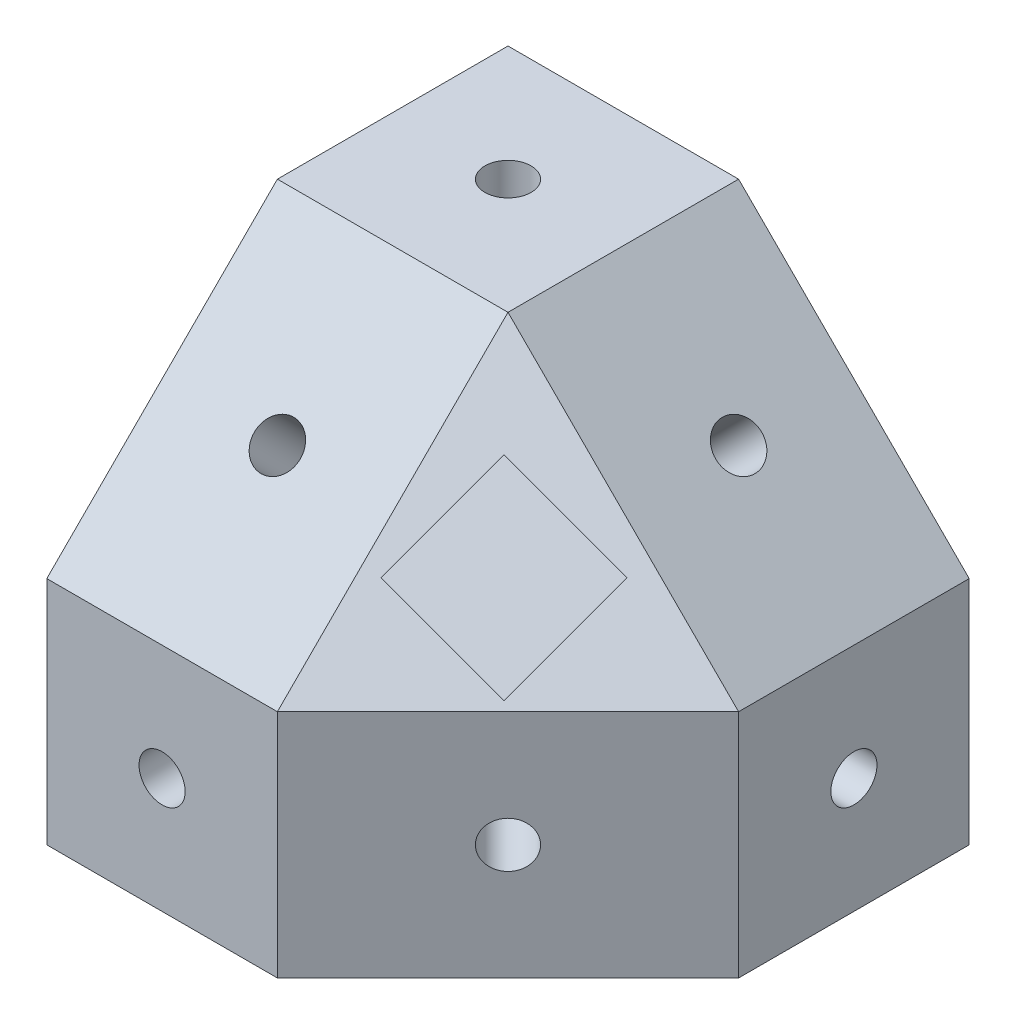
ISO-10303-21;
HEADER;
FILE_DESCRIPTION(('STEP AP214'),'2;1');
FILE_NAME('part.step','',(''),(''),'','','');
FILE_SCHEMA(('AUTOMOTIVE_DESIGN { 1 0 10303 214 1 1 1 1 }'));
ENDSEC;
DATA;
#1=APPLICATION_CONTEXT('core data for automotive mechanical design processes');
#2=APPLICATION_PROTOCOL_DEFINITION('international standard','automotive_design',2000,#1);
#3=PRODUCT_CONTEXT('',#1,'mechanical');
#4=PRODUCT('Part','Part','',(#3));
#5=PRODUCT_RELATED_PRODUCT_CATEGORY('part','',(#4));
#6=PRODUCT_DEFINITION_FORMATION('','',#4);
#7=PRODUCT_DEFINITION_CONTEXT('part definition',#1,'design');
#8=PRODUCT_DEFINITION('design','',#6,#7);
#9=PRODUCT_DEFINITION_SHAPE('','',#8);
#10=(LENGTH_UNIT() NAMED_UNIT(*) SI_UNIT(.MILLI.,.METRE.));
#11=(NAMED_UNIT(*) PLANE_ANGLE_UNIT() SI_UNIT($,.RADIAN.));
#12=(NAMED_UNIT(*) SI_UNIT($,.STERADIAN.) SOLID_ANGLE_UNIT());
#13=UNCERTAINTY_MEASURE_WITH_UNIT(LENGTH_MEASURE(1.E-05),#10,'distance_accuracy_value','');
#14=(GEOMETRIC_REPRESENTATION_CONTEXT(3) GLOBAL_UNCERTAINTY_ASSIGNED_CONTEXT((#13)) GLOBAL_UNIT_ASSIGNED_CONTEXT((#10,
#11,#12)) REPRESENTATION_CONTEXT('',''));
#15=CARTESIAN_POINT('',(0.,0.,0.));
#16=DIRECTION('',(0.,0.,1.));
#17=DIRECTION('',(1.,0.,0.));
#18=AXIS2_PLACEMENT_3D('',#15,#16,#17);
#19=CARTESIAN_POINT('',(15.,30.,-30.));
#20=DIRECTION('',(-0.707106781186547,-0.707106781186548,0.));
#21=DIRECTION('',(0.707106781186548,-0.707106781186547,0.));
#22=AXIS2_PLACEMENT_3D('',#19,#20,#21);
#23=PLANE('',#22);
#24=CARTESIAN_POINT('',(22.5011325855167,22.4988674144833,-22.5));
#25=DIRECTION('',(0.707106781186547,0.707106781186548,0.));
#26=DIRECTION('',(-0.707106781186548,0.707106781186547,0.));
#27=AXIS2_PLACEMENT_3D('',#24,#25,#26);
#28=CIRCLE('',#27,1.5);
#29=CARTESIAN_POINT('',(21.4404724137368,23.5595275862632,-22.5));
#30=VERTEX_POINT('',#29);
#31=EDGE_CURVE('E189',#30,#30,#28,.T.);
#32=ORIENTED_EDGE('',*,*,#31,.F.);
#33=EDGE_LOOP('',(#32));
#34=FACE_BOUND('',#33,.T.);
#35=DIRECTION('',(-0.707106781186548,0.707106781186547,0.));
#36=VECTOR('',#35,1.);
#37=CARTESIAN_POINT('',(15.,30.,-15.));
#38=LINE('',#37,#36);
#39=CARTESIAN_POINT('',(30.,15.,-15.));
#40=VERTEX_POINT('',#39);
#41=CARTESIAN_POINT('',(15.,30.,-15.));
#42=VERTEX_POINT('',#41);
#43=EDGE_CURVE('E267',#40,#42,#38,.T.);
#44=ORIENTED_EDGE('',*,*,#43,.F.);
#45=DIRECTION('',(0.,0.,1.));
#46=VECTOR('',#45,1.);
#47=CARTESIAN_POINT('',(30.,15.,-30.));
#48=LINE('',#47,#46);
#49=CARTESIAN_POINT('',(30.,15.,-30.));
#50=VERTEX_POINT('',#49);
#51=EDGE_CURVE('E295',#50,#40,#48,.T.);
#52=ORIENTED_EDGE('',*,*,#51,.F.);
#53=DIRECTION('',(0.707106781186548,-0.707106781186547,0.));
#54=VECTOR('',#53,1.);
#55=CARTESIAN_POINT('',(15.,30.,-30.));
#56=LINE('',#55,#54);
#57=CARTESIAN_POINT('',(15.,30.,-30.));
#58=VERTEX_POINT('',#57);
#59=EDGE_CURVE('E288',#58,#50,#56,.T.);
#60=ORIENTED_EDGE('',*,*,#59,.F.);
#61=DIRECTION('',(0.,0.,1.));
#62=VECTOR('',#61,1.);
#63=CARTESIAN_POINT('',(15.,30.,-30.));
#64=LINE('',#63,#62);
#65=EDGE_CURVE('E294',#58,#42,#64,.T.);
#66=ORIENTED_EDGE('',*,*,#65,.T.);
#67=EDGE_LOOP('',(#44,#52,#60,#66));
#68=FACE_BOUND('',#67,.T.);
#69=ADVANCED_FACE('F71',(#34,#68),#23,.F.);
#70=CARTESIAN_POINT('',(30.,15.,0.));
#71=DIRECTION('',(0.,-0.707106781186547,-0.707106781186547));
#72=DIRECTION('',(0.,0.707106781186548,-0.707106781186548));
#73=AXIS2_PLACEMENT_3D('',#70,#71,#72);
#74=PLANE('',#73);
#75=CARTESIAN_POINT('',(7.5,22.5,-7.5));
#76=DIRECTION('',(0.,0.707106781186548,0.707106781186547));
#77=DIRECTION('',(0.,-0.707106781186547,0.707106781186548));
#78=AXIS2_PLACEMENT_3D('',#75,#76,#77);
#79=CIRCLE('',#78,1.5);
#80=CARTESIAN_POINT('',(7.5,21.4393398282202,-6.43933982822018));
#81=VERTEX_POINT('',#80);
#82=EDGE_CURVE('E203',#81,#81,#79,.T.);
#83=ORIENTED_EDGE('',*,*,#82,.F.);
#84=EDGE_LOOP('',(#83));
#85=FACE_BOUND('',#84,.T.);
#86=DIRECTION('',(0.,-0.707106781186548,0.707106781186548));
#87=VECTOR('',#86,1.);
#88=CARTESIAN_POINT('',(15.,15.,0.));
#89=LINE('',#88,#87);
#90=CARTESIAN_POINT('',(15.,15.,0.));
#91=VERTEX_POINT('',#90);
#92=EDGE_CURVE('E255',#42,#91,#89,.T.);
#93=ORIENTED_EDGE('',*,*,#92,.F.);
#94=DIRECTION('',(-1.,0.,0.));
#95=VECTOR('',#94,1.);
#96=CARTESIAN_POINT('',(30.,30.,-15.));
#97=LINE('',#96,#95);
#98=CARTESIAN_POINT('',(0.,30.,-15.));
#99=VERTEX_POINT('',#98);
#100=EDGE_CURVE('E284',#42,#99,#97,.T.);
#101=ORIENTED_EDGE('',*,*,#100,.T.);
#102=DIRECTION('',(0.,-0.707106781186547,0.707106781186547));
#103=VECTOR('',#102,1.);
#104=CARTESIAN_POINT('',(0.,15.,0.));
#105=LINE('',#104,#103);
#106=CARTESIAN_POINT('',(0.,15.,0.));
#107=VERTEX_POINT('',#106);
#108=EDGE_CURVE('E278',#99,#107,#105,.T.);
#109=ORIENTED_EDGE('',*,*,#108,.T.);
#110=DIRECTION('',(-1.,0.,0.));
#111=VECTOR('',#110,1.);
#112=CARTESIAN_POINT('',(30.,15.,0.));
#113=LINE('',#112,#111);
#114=EDGE_CURVE('E285',#91,#107,#113,.T.);
#115=ORIENTED_EDGE('',*,*,#114,.F.);
#116=EDGE_LOOP('',(#93,#101,#109,#115));
#117=FACE_BOUND('',#116,.T.);
#118=ADVANCED_FACE('F371',(#85,#117),#74,.F.);
#119=CARTESIAN_POINT('',(15.,30.,0.));
#120=DIRECTION('',(-0.707106781186547,0.,-0.707106781186547));
#121=DIRECTION('',(-0.707106781186548,0.,0.707106781186548));
#122=AXIS2_PLACEMENT_3D('',#119,#120,#121);
#123=PLANE('',#122);
#124=CARTESIAN_POINT('',(22.4988674144833,7.5,-7.49886741448334));
#125=DIRECTION('',(0.707106781186548,0.,0.707106781186547));
#126=DIRECTION('',(0.707106781186547,0.,-0.707106781186548));
#127=AXIS2_PLACEMENT_3D('',#124,#125,#126);
#128=CIRCLE('',#127,1.5);
#129=CARTESIAN_POINT('',(23.5595275862632,7.5,-8.55952758626316));
#130=VERTEX_POINT('',#129);
#131=EDGE_CURVE('E175',#130,#130,#128,.T.);
#132=ORIENTED_EDGE('',*,*,#131,.F.);
#133=EDGE_LOOP('',(#132));
#134=FACE_BOUND('',#133,.T.);
#135=DIRECTION('',(0.707106781186548,0.,-0.707106781186548));
#136=VECTOR('',#135,1.);
#137=CARTESIAN_POINT('',(15.,15.,0.));
#138=LINE('',#137,#136);
#139=EDGE_CURVE('E329',#91,#40,#138,.T.);
#140=ORIENTED_EDGE('',*,*,#139,.F.);
#141=DIRECTION('',(0.,-1.,0.));
#142=VECTOR('',#141,1.);
#143=CARTESIAN_POINT('',(15.,30.,0.));
#144=LINE('',#143,#142);
#145=CARTESIAN_POINT('',(15.,0.,0.));
#146=VERTEX_POINT('',#145);
#147=EDGE_CURVE('E273',#91,#146,#144,.T.);
#148=ORIENTED_EDGE('',*,*,#147,.T.);
#149=DIRECTION('',(0.707106781186547,0.,-0.707106781186547));
#150=VECTOR('',#149,1.);
#151=CARTESIAN_POINT('',(15.,0.,0.));
#152=LINE('',#151,#150);
#153=CARTESIAN_POINT('',(30.,0.,-15.));
#154=VERTEX_POINT('',#153);
#155=EDGE_CURVE('E270',#146,#154,#152,.T.);
#156=ORIENTED_EDGE('',*,*,#155,.T.);
#157=DIRECTION('',(0.,-1.,0.));
#158=VECTOR('',#157,1.);
#159=CARTESIAN_POINT('',(30.,30.,-15.));
#160=LINE('',#159,#158);
#161=EDGE_CURVE('E274',#40,#154,#160,.T.);
#162=ORIENTED_EDGE('',*,*,#161,.F.);
#163=EDGE_LOOP('',(#140,#148,#156,#162));
#164=FACE_BOUND('',#163,.T.);
#165=ADVANCED_FACE('F350',(#134,#164),#123,.F.);
#166=CARTESIAN_POINT('',(0.,0.,-30.));
#167=DIRECTION('',(-1.,0.,0.));
#168=DIRECTION('',(0.,-1.,0.));
#169=AXIS2_PLACEMENT_3D('',#166,#167,#168);
#170=PLANE('',#169);
#171=ORIENTED_EDGE('',*,*,#108,.F.);
#172=DIRECTION('',(0.,0.,1.));
#173=VECTOR('',#172,1.);
#174=CARTESIAN_POINT('',(0.,30.,-30.));
#175=LINE('',#174,#173);
#176=CARTESIAN_POINT('',(0.,30.,-30.));
#177=VERTEX_POINT('',#176);
#178=EDGE_CURVE('E325',#177,#99,#175,.T.);
#179=ORIENTED_EDGE('',*,*,#178,.F.);
#180=DIRECTION('',(0.,-1.,0.));
#181=VECTOR('',#180,1.);
#182=CARTESIAN_POINT('',(0.,0.,-30.));
#183=LINE('',#182,#181);
#184=CARTESIAN_POINT('',(0.,0.,-30.));
#185=VERTEX_POINT('',#184);
#186=EDGE_CURVE('E303',#177,#185,#183,.T.);
#187=ORIENTED_EDGE('',*,*,#186,.T.);
#188=DIRECTION('',(0.,0.,1.));
#189=VECTOR('',#188,1.);
#190=CARTESIAN_POINT('',(0.,0.,-30.));
#191=LINE('',#190,#189);
#192=CARTESIAN_POINT('',(0.,0.,0.));
#193=VERTEX_POINT('',#192);
#194=EDGE_CURVE('E319',#185,#193,#191,.T.);
#195=ORIENTED_EDGE('',*,*,#194,.T.);
#196=DIRECTION('',(0.,-1.,0.));
#197=VECTOR('',#196,1.);
#198=CARTESIAN_POINT('',(0.,0.,0.));
#199=LINE('',#198,#197);
#200=EDGE_CURVE('E299',#107,#193,#199,.T.);
#201=ORIENTED_EDGE('',*,*,#200,.F.);
#202=EDGE_LOOP('',(#171,#179,#187,#195,#201));
#203=FACE_BOUND('',#202,.T.);
#204=ADVANCED_FACE('F73',(#203),#170,.T.);
#205=CARTESIAN_POINT('',(0.,30.,-30.));
#206=DIRECTION('',(0.,1.,0.));
#207=DIRECTION('',(0.,0.,1.));
#208=AXIS2_PLACEMENT_3D('',#205,#206,#207);
#209=PLANE('',#208);
#210=CARTESIAN_POINT('',(7.49999999999999,30.,-22.5));
#211=DIRECTION('',(0.,1.,0.));
#212=DIRECTION('',(0.,0.,1.));
#213=AXIS2_PLACEMENT_3D('',#210,#211,#212);
#214=CIRCLE('',#213,1.5);
#215=CARTESIAN_POINT('',(7.49999999999999,30.,-21.));
#216=VERTEX_POINT('',#215);
#217=EDGE_CURVE('E211',#216,#216,#214,.T.);
#218=ORIENTED_EDGE('',*,*,#217,.F.);
#219=EDGE_LOOP('',(#218));
#220=FACE_BOUND('',#219,.T.);
#221=ORIENTED_EDGE('',*,*,#100,.F.);
#222=ORIENTED_EDGE('',*,*,#65,.F.);
#223=DIRECTION('',(-1.,0.,0.));
#224=VECTOR('',#223,1.);
#225=CARTESIAN_POINT('',(0.,30.,-30.));
#226=LINE('',#225,#224);
#227=EDGE_CURVE('E316',#58,#177,#226,.T.);
#228=ORIENTED_EDGE('',*,*,#227,.T.);
#229=ORIENTED_EDGE('',*,*,#178,.T.);
#230=EDGE_LOOP('',(#221,#222,#228,#229));
#231=FACE_BOUND('',#230,.T.);
#232=ADVANCED_FACE('F369',(#220,#231),#209,.T.);
#233=CARTESIAN_POINT('',(30.,0.,-30.));
#234=DIRECTION('',(1.,0.,0.));
#235=DIRECTION('',(0.,1.,0.));
#236=AXIS2_PLACEMENT_3D('',#233,#234,#235);
#237=PLANE('',#236);
#238=CARTESIAN_POINT('',(30.,7.5,-22.5));
#239=DIRECTION('',(1.,0.,0.));
#240=DIRECTION('',(0.,1.,0.));
#241=AXIS2_PLACEMENT_3D('',#238,#239,#240);
#242=CIRCLE('',#241,1.5);
#243=CARTESIAN_POINT('',(30.,9.,-22.5));
#244=VERTEX_POINT('',#243);
#245=EDGE_CURVE('E179',#244,#244,#242,.T.);
#246=ORIENTED_EDGE('',*,*,#245,.F.);
#247=EDGE_LOOP('',(#246));
#248=FACE_BOUND('',#247,.T.);
#249=ORIENTED_EDGE('',*,*,#161,.T.);
#250=DIRECTION('',(0.,0.,1.));
#251=VECTOR('',#250,1.);
#252=CARTESIAN_POINT('',(30.,0.,-30.));
#253=LINE('',#252,#251);
#254=CARTESIAN_POINT('',(30.,0.,-30.));
#255=VERTEX_POINT('',#254);
#256=EDGE_CURVE('E330',#255,#154,#253,.T.);
#257=ORIENTED_EDGE('',*,*,#256,.F.);
#258=DIRECTION('',(0.,1.,0.));
#259=VECTOR('',#258,1.);
#260=CARTESIAN_POINT('',(30.,0.,-30.));
#261=LINE('',#260,#259);
#262=EDGE_CURVE('E312',#255,#50,#261,.T.);
#263=ORIENTED_EDGE('',*,*,#262,.T.);
#264=ORIENTED_EDGE('',*,*,#51,.T.);
#265=EDGE_LOOP('',(#249,#257,#263,#264));
#266=FACE_BOUND('',#265,.T.);
#267=ADVANCED_FACE('F353',(#248,#266),#237,.T.);
#268=CARTESIAN_POINT('',(0.,0.,-30.));
#269=DIRECTION('',(0.,-1.,0.));
#270=DIRECTION('',(0.,0.,-1.));
#271=AXIS2_PLACEMENT_3D('',#268,#269,#270);
#272=PLANE('',#271);
#273=ORIENTED_EDGE('',*,*,#155,.F.);
#274=DIRECTION('',(1.,0.,0.));
#275=VECTOR('',#274,1.);
#276=CARTESIAN_POINT('',(0.,0.,0.));
#277=LINE('',#276,#275);
#278=EDGE_CURVE('E308',#193,#146,#277,.T.);
#279=ORIENTED_EDGE('',*,*,#278,.F.);
#280=ORIENTED_EDGE('',*,*,#194,.F.);
#281=DIRECTION('',(1.,0.,0.));
#282=VECTOR('',#281,1.);
#283=CARTESIAN_POINT('',(0.,0.,-30.));
#284=LINE('',#283,#282);
#285=EDGE_CURVE('E307',#185,#255,#284,.T.);
#286=ORIENTED_EDGE('',*,*,#285,.T.);
#287=ORIENTED_EDGE('',*,*,#256,.T.);
#288=EDGE_LOOP('',(#273,#279,#280,#286,#287));
#289=FACE_BOUND('',#288,.T.);
#290=ADVANCED_FACE('F361',(#289),#272,.T.);
#291=CARTESIAN_POINT('',(0.,0.,-30.));
#292=DIRECTION('',(0.,0.,-1.));
#293=DIRECTION('',(-1.,0.,0.));
#294=AXIS2_PLACEMENT_3D('',#291,#292,#293);
#295=PLANE('',#294);
#296=ORIENTED_EDGE('',*,*,#59,.T.);
#297=ORIENTED_EDGE('',*,*,#262,.F.);
#298=ORIENTED_EDGE('',*,*,#285,.F.);
#299=ORIENTED_EDGE('',*,*,#186,.F.);
#300=ORIENTED_EDGE('',*,*,#227,.F.);
#301=EDGE_LOOP('',(#296,#297,#298,#299,#300));
#302=FACE_BOUND('',#301,.T.);
#303=ADVANCED_FACE('F357',(#302),#295,.T.);
#304=CARTESIAN_POINT('',(0.,0.,0.));
#305=DIRECTION('',(0.,0.,-1.));
#306=DIRECTION('',(-1.,0.,0.));
#307=AXIS2_PLACEMENT_3D('',#304,#305,#306);
#308=PLANE('',#307);
#309=CARTESIAN_POINT('',(7.49999999999999,7.5,0.));
#310=DIRECTION('',(0.,0.,1.));
#311=DIRECTION('',(1.,0.,0.));
#312=AXIS2_PLACEMENT_3D('',#309,#310,#311);
#313=CIRCLE('',#312,1.5);
#314=CARTESIAN_POINT('',(8.99999999999999,7.5,0.));
#315=VERTEX_POINT('',#314);
#316=EDGE_CURVE('E195',#315,#315,#313,.T.);
#317=ORIENTED_EDGE('',*,*,#316,.F.);
#318=EDGE_LOOP('',(#317));
#319=FACE_BOUND('',#318,.T.);
#320=ORIENTED_EDGE('',*,*,#278,.T.);
#321=ORIENTED_EDGE('',*,*,#147,.F.);
#322=ORIENTED_EDGE('',*,*,#114,.T.);
#323=ORIENTED_EDGE('',*,*,#200,.T.);
#324=EDGE_LOOP('',(#320,#321,#322,#323));
#325=FACE_BOUND('',#324,.T.);
#326=ADVANCED_FACE('F374',(#319,#325),#308,.F.);
#327=CARTESIAN_POINT('',(33.9969093541148,3.5700475177221,-7.56695687183688));
#328=DIRECTION('',(0.577350269189626,0.577350269189626,0.577350269189625));
#329=DIRECTION('',(-0.707106781186547,0.707106781186548,0.));
#330=AXIS2_PLACEMENT_3D('',#327,#328,#329);
#331=PLANE('',#330);
#332=DIRECTION('',(0.788675134594812,-0.577350269189629,-0.211324865405183));
#333=VECTOR('',#332,1.);
#334=CARTESIAN_POINT('',(22.1689725569192,15.4082482904639,-7.57722084738306));
#335=LINE('',#334,#333);
#336=CARTESIAN_POINT('',(15.8595714801607,20.0270504439809,-5.88662192414159));
#337=VERTEX_POINT('',#336);
#338=CARTESIAN_POINT('',(22.1689725569192,15.4082482904639,-7.57722084738306));
#339=VERTEX_POINT('',#338);
#340=EDGE_CURVE('E219',#337,#339,#335,.T.);
#341=ORIENTED_EDGE('',*,*,#340,.F.);
#342=DIRECTION('',(-0.211324865405191,-0.577350269189623,0.788675134594814));
#343=VECTOR('',#342,1.);
#344=CARTESIAN_POINT('',(15.8595714801607,20.0270504439809,-5.88662192414159));
#345=LINE('',#344,#343);
#346=CARTESIAN_POINT('',(17.5501704034022,24.6458525974979,-12.1960230009001));
#347=VERTEX_POINT('',#346);
#348=EDGE_CURVE('E228',#347,#337,#345,.T.);
#349=ORIENTED_EDGE('',*,*,#348,.F.);
#350=DIRECTION('',(-0.788675134594811,0.577350269189629,0.211324865405183));
#351=VECTOR('',#350,1.);
#352=CARTESIAN_POINT('',(17.5501704034022,24.6458525974979,-12.1960230009001));
#353=LINE('',#352,#351);
#354=CARTESIAN_POINT('',(23.8595714801607,20.0270504439808,-13.8866219241416));
#355=VERTEX_POINT('',#354);
#356=EDGE_CURVE('E245',#355,#347,#353,.T.);
#357=ORIENTED_EDGE('',*,*,#356,.F.);
#358=DIRECTION('',(0.211324865405191,0.577350269189623,-0.788675134594814));
#359=VECTOR('',#358,1.);
#360=CARTESIAN_POINT('',(23.8595714801607,20.0270504439808,-13.8866219241416));
#361=LINE('',#360,#359);
#362=EDGE_CURVE('E242',#339,#355,#361,.T.);
#363=ORIENTED_EDGE('',*,*,#362,.F.);
#364=EDGE_LOOP('',(#341,#349,#357,#363));
#365=FACE_BOUND('',#364,.T.);
#366=ORIENTED_EDGE('',*,*,#43,.T.);
#367=ORIENTED_EDGE('',*,*,#92,.T.);
#368=ORIENTED_EDGE('',*,*,#139,.T.);
#369=EDGE_LOOP('',(#366,#367,#368));
#370=FACE_BOUND('',#369,.T.);
#371=ADVANCED_FACE('F343',(#365,#370),#331,.T.);
#372=CARTESIAN_POINT('',(13.5087185190748,6.74799425261948,-16.2374748852274));
#373=DIRECTION('',(-0.211324865405191,-0.577350269189623,0.788675134594814));
#374=DIRECTION('',(0.,-0.806898221355075,-0.59069049456887));
#375=AXIS2_PLACEMENT_3D('',#372,#373,#374);
#376=PLANE('',#375);
#377=DIRECTION('',(0.577350269189626,0.577350269189626,0.577350269189625));
#378=VECTOR('',#377,1.);
#379=CARTESIAN_POINT('',(13.5087185190748,6.74799425261948,-16.2374748852274));
#380=LINE('',#379,#378);
#381=CARTESIAN_POINT('',(15.7501414195185,8.9894171530632,-13.9960519847837));
#382=VERTEX_POINT('',#381);
#383=EDGE_CURVE('E94',#382,#339,#380,.T.);
#384=ORIENTED_EDGE('',*,*,#383,.F.);
#385=CARTESIAN_POINT('',(14.6043362426511,7.5,-15.3933985863156));
#386=DIRECTION('',(-0.211324865405191,-0.577350269189623,0.788675134594814));
#387=DIRECTION('',(0.869104022117883,0.258198889747158,0.421890426617925));
#388=AXIS2_PLACEMENT_3D('',#385,#386,#387);
#389=ELLIPSE('',#388,3.67423461417479,1.5);
#390=CARTESIAN_POINT('',(15.0839669343387,8.91899901072835,-14.2261025580696));
#391=VERTEX_POINT('',#390);
#392=EDGE_CURVE('E170',#382,#391,#389,.T.);
#393=ORIENTED_EDGE('',*,*,#392,.T.);
#394=DIRECTION('',(-0.447213595499955,0.774596669241487,0.447213595499955));
#395=VECTOR('',#394,1.);
#396=CARTESIAN_POINT('',(15.9232498256211,7.46531840110381,-15.0653854493521));
#397=LINE('',#396,#395);
#398=CARTESIAN_POINT('',(15.3020288902856,8.54130462383032,-14.4441645140166));
#399=VERTEX_POINT('',#398);
#400=EDGE_CURVE('E163',#399,#391,#397,.T.);
#401=ORIENTED_EDGE('',*,*,#400,.F.);
#402=CARTESIAN_POINT('',(13.5087185190748,6.74799425261948,-16.2374748852274));
#403=VERTEX_POINT('',#402);
#404=EDGE_CURVE('E262',#403,#399,#380,.T.);
#405=ORIENTED_EDGE('',*,*,#404,.F.);
#406=DIRECTION('',(0.788675134594812,-0.577350269189629,-0.211324865405183));
#407=VECTOR('',#406,1.);
#408=CARTESIAN_POINT('',(13.5087185190748,6.74799425261948,-16.2374748852274));
#409=LINE('',#408,#407);
#410=CARTESIAN_POINT('',(7.19931744231632,11.3667964061365,-14.546875961986));
#411=VERTEX_POINT('',#410);
#412=EDGE_CURVE('E223',#411,#403,#409,.T.);
#413=ORIENTED_EDGE('',*,*,#412,.F.);
#414=DIRECTION('',(0.577350269189626,0.577350269189626,0.577350269189625));
#415=VECTOR('',#414,1.);
#416=CARTESIAN_POINT('',(7.19931744231632,11.3667964061365,-14.546875961986));
#417=LINE('',#416,#415);
#418=EDGE_CURVE('E252',#411,#337,#417,.T.);
#419=ORIENTED_EDGE('',*,*,#418,.T.);
#420=ORIENTED_EDGE('',*,*,#340,.T.);
#421=EDGE_LOOP('',(#384,#393,#401,#405,#413,#419,#420));
#422=FACE_BOUND('',#421,.T.);
#423=ADVANCED_FACE('F177',(#422),#376,.F.);
#424=CARTESIAN_POINT('',(7.19931744231632,11.3667964061365,-14.546875961986));
#425=DIRECTION('',(-0.788675134594812,0.577350269189629,0.211324865405183));
#426=DIRECTION('',(-0.590690494568875,-0.806898221355071,0.));
#427=AXIS2_PLACEMENT_3D('',#424,#425,#426);
#428=PLANE('',#427);
#429=ORIENTED_EDGE('',*,*,#348,.T.);
#430=ORIENTED_EDGE('',*,*,#418,.F.);
#431=DIRECTION('',(-0.211324865405191,-0.577350269189623,0.788675134594814));
#432=VECTOR('',#431,1.);
#433=CARTESIAN_POINT('',(7.19931744231632,11.3667964061365,-14.546875961986));
#434=LINE('',#433,#432);
#435=CARTESIAN_POINT('',(8.88991636555784,15.9855985596535,-20.8562770387445));
#436=VERTEX_POINT('',#435);
#437=EDGE_CURVE('E236',#436,#411,#434,.T.);
#438=ORIENTED_EDGE('',*,*,#437,.F.);
#439=DIRECTION('',(0.577350269189626,0.577350269189626,0.577350269189625));
#440=VECTOR('',#439,1.);
#441=CARTESIAN_POINT('',(8.88991636555784,15.9855985596535,-20.8562770387445));
#442=LINE('',#441,#440);
#443=EDGE_CURVE('E256',#436,#347,#442,.T.);
#444=ORIENTED_EDGE('',*,*,#443,.T.);
#445=EDGE_LOOP('',(#429,#430,#438,#444));
#446=FACE_BOUND('',#445,.T.);
#447=ADVANCED_FACE('F406',(#446),#428,.F.);
#448=CARTESIAN_POINT('',(8.88991636555784,15.9855985596535,-20.8562770387445));
#449=DIRECTION('',(0.211324865405191,0.577350269189622,-0.788675134594814));
#450=DIRECTION('',(0.,0.806898221355076,0.590690494568869));
#451=AXIS2_PLACEMENT_3D('',#448,#449,#450);
#452=PLANE('',#451);
#453=ORIENTED_EDGE('',*,*,#356,.T.);
#454=ORIENTED_EDGE('',*,*,#443,.F.);
#455=DIRECTION('',(-0.788675134594811,0.577350269189629,0.211324865405183));
#456=VECTOR('',#455,1.);
#457=CARTESIAN_POINT('',(8.88991636555784,15.9855985596535,-20.8562770387445));
#458=LINE('',#457,#456);
#459=CARTESIAN_POINT('',(15.1993174423163,11.3667964061365,-22.546875961986));
#460=VERTEX_POINT('',#459);
#461=EDGE_CURVE('E232',#460,#436,#458,.T.);
#462=ORIENTED_EDGE('',*,*,#461,.F.);
#463=DIRECTION('',(0.577350269189626,0.577350269189626,0.577350269189625));
#464=VECTOR('',#463,1.);
#465=CARTESIAN_POINT('',(15.1993174423163,11.3667964061365,-22.546875961986));
#466=LINE('',#465,#464);
#467=EDGE_CURVE('E259',#460,#355,#466,.T.);
#468=ORIENTED_EDGE('',*,*,#467,.T.);
#469=EDGE_LOOP('',(#453,#454,#462,#468));
#470=FACE_BOUND('',#469,.T.);
#471=ADVANCED_FACE('F411',(#470),#452,.F.);
#472=CARTESIAN_POINT('',(15.1993174423163,11.3667964061365,-22.546875961986));
#473=DIRECTION('',(0.788675134594812,-0.577350269189629,-0.211324865405183));
#474=DIRECTION('',(0.590690494568875,0.806898221355071,0.));
#475=AXIS2_PLACEMENT_3D('',#472,#473,#474);
#476=PLANE('',#475);
#477=DIRECTION('',(-0.447213595499961,-0.77459666924148,0.447213595499961));
#478=VECTOR('',#477,1.);
#479=CARTESIAN_POINT('',(17.8808079549502,13.0078809853242,-17.0229435786811));
#480=LINE('',#479,#478);
#481=CARTESIAN_POINT('',(15.5600939406026,8.98828640263706,-14.7022295643335));
#482=VERTEX_POINT('',#481);
#483=EDGE_CURVE('E80',#482,#399,#480,.T.);
#484=ORIENTED_EDGE('',*,*,#483,.F.);
#485=CARTESIAN_POINT('',(14.168653714924,7.5,-15.8290811140426));
#486=DIRECTION('',(0.788675134594812,-0.577350269189629,-0.211324865405183));
#487=DIRECTION('',(0.421890426617923,0.258198889747164,0.869104022117881));
#488=AXIS2_PLACEMENT_3D('',#485,#486,#487);
#489=ELLIPSE('',#488,3.67423461417475,1.5);
#490=EDGE_CURVE('E12',#482,#382,#489,.T.);
#491=ORIENTED_EDGE('',*,*,#490,.T.);
#492=ORIENTED_EDGE('',*,*,#383,.T.);
#493=ORIENTED_EDGE('',*,*,#362,.T.);
#494=ORIENTED_EDGE('',*,*,#467,.F.);
#495=DIRECTION('',(0.211324865405191,0.577350269189623,-0.788675134594814));
#496=VECTOR('',#495,1.);
#497=CARTESIAN_POINT('',(15.1993174423163,11.3667964061365,-22.546875961986));
#498=LINE('',#497,#496);
#499=EDGE_CURVE('E227',#403,#460,#498,.T.);
#500=ORIENTED_EDGE('',*,*,#499,.F.);
#501=ORIENTED_EDGE('',*,*,#404,.T.);
#502=EDGE_LOOP('',(#484,#491,#492,#493,#494,#500,#501));
#503=FACE_BOUND('',#502,.T.);
#504=ADVANCED_FACE('F407',(#503),#476,.F.);
#505=CARTESIAN_POINT('',(1.33974596215563,1.33974596215563,1.33974596215563));
#506=DIRECTION('',(-0.577350269189626,-0.577350269189626,-0.577350269189625));
#507=DIRECTION('',(0.707106781186547,-0.707106781186548,0.));
#508=AXIS2_PLACEMENT_3D('',#505,#506,#507);
#509=PLANE('',#508);
#510=ORIENTED_EDGE('',*,*,#412,.T.);
#511=ORIENTED_EDGE('',*,*,#499,.T.);
#512=ORIENTED_EDGE('',*,*,#461,.T.);
#513=ORIENTED_EDGE('',*,*,#437,.T.);
#514=EDGE_LOOP('',(#510,#511,#512,#513));
#515=FACE_BOUND('',#514,.T.);
#516=ADVANCED_FACE('F410',(#515),#509,.F.);
#517=CARTESIAN_POINT('',(7.49999999999999,20.,-22.5));
#518=DIRECTION('',(0.,1.,0.));
#519=DIRECTION('',(0.,0.,1.));
#520=AXIS2_PLACEMENT_3D('',#517,#518,#519);
#521=CYLINDRICAL_SURFACE('',#520,1.5);
#522=CARTESIAN_POINT('',(7.49999999999999,20.,-22.5));
#523=DIRECTION('',(0.,1.,0.));
#524=DIRECTION('',(0.,0.,1.));
#525=AXIS2_PLACEMENT_3D('',#522,#523,#524);
#526=CIRCLE('',#525,1.5);
#527=CARTESIAN_POINT('',(7.49999999999999,20.,-21.));
#528=VERTEX_POINT('',#527);
#529=EDGE_CURVE('E215',#528,#528,#526,.T.);
#530=ORIENTED_EDGE('',*,*,#529,.F.);
#531=EDGE_LOOP('',(#530));
#532=FACE_BOUND('',#531,.T.);
#533=ORIENTED_EDGE('',*,*,#217,.T.);
#534=EDGE_LOOP('',(#533));
#535=FACE_BOUND('',#534,.T.);
#536=ADVANCED_FACE('F420',(#532,#535),#521,.F.);
#537=CARTESIAN_POINT('',(7.49999999999999,20.,-22.5));
#538=DIRECTION('',(0.,1.,0.));
#539=DIRECTION('',(0.,0.,1.));
#540=AXIS2_PLACEMENT_3D('',#537,#538,#539);
#541=PLANE('',#540);
#542=ORIENTED_EDGE('',*,*,#529,.T.);
#543=EDGE_LOOP('',(#542));
#544=FACE_BOUND('',#543,.T.);
#545=ADVANCED_FACE('F424',(#544),#541,.T.);
#546=CARTESIAN_POINT('',(7.5,15.4289321881345,-14.5710678118655));
#547=DIRECTION('',(0.,0.707106781186548,0.707106781186547));
#548=DIRECTION('',(0.,-0.707106781186547,0.707106781186548));
#549=AXIS2_PLACEMENT_3D('',#546,#547,#548);
#550=CYLINDRICAL_SURFACE('',#549,1.5);
#551=CARTESIAN_POINT('',(7.5,15.4289321881345,-14.5710678118655));
#552=DIRECTION('',(0.,0.707106781186548,0.707106781186547));
#553=DIRECTION('',(0.,-0.707106781186547,0.707106781186548));
#554=AXIS2_PLACEMENT_3D('',#551,#552,#553);
#555=CIRCLE('',#554,1.5);
#556=CARTESIAN_POINT('',(7.5,14.3682720163547,-13.5104076400857));
#557=VERTEX_POINT('',#556);
#558=EDGE_CURVE('E207',#557,#557,#555,.T.);
#559=ORIENTED_EDGE('',*,*,#558,.F.);
#560=EDGE_LOOP('',(#559));
#561=FACE_BOUND('',#560,.T.);
#562=ORIENTED_EDGE('',*,*,#82,.T.);
#563=EDGE_LOOP('',(#562));
#564=FACE_BOUND('',#563,.T.);
#565=ADVANCED_FACE('F428',(#561,#564),#550,.F.);
#566=CARTESIAN_POINT('',(7.5,15.4289321881345,-14.5710678118655));
#567=DIRECTION('',(0.,0.707106781186548,0.707106781186547));
#568=DIRECTION('',(0.,-0.707106781186547,0.707106781186548));
#569=AXIS2_PLACEMENT_3D('',#566,#567,#568);
#570=PLANE('',#569);
#571=ORIENTED_EDGE('',*,*,#558,.T.);
#572=EDGE_LOOP('',(#571));
#573=FACE_BOUND('',#572,.T.);
#574=ADVANCED_FACE('F432',(#573),#570,.T.);
#575=CARTESIAN_POINT('',(7.49999999999999,7.5,-10.));
#576=DIRECTION('',(0.,0.,1.));
#577=DIRECTION('',(1.,0.,0.));
#578=AXIS2_PLACEMENT_3D('',#575,#576,#577);
#579=CYLINDRICAL_SURFACE('',#578,1.5);
#580=CARTESIAN_POINT('',(7.49999999999999,7.5,-10.));
#581=DIRECTION('',(0.,0.,1.));
#582=DIRECTION('',(1.,0.,0.));
#583=AXIS2_PLACEMENT_3D('',#580,#581,#582);
#584=CIRCLE('',#583,1.5);
#585=CARTESIAN_POINT('',(8.99999999999999,7.5,-10.));
#586=VERTEX_POINT('',#585);
#587=EDGE_CURVE('E199',#586,#586,#584,.T.);
#588=ORIENTED_EDGE('',*,*,#587,.F.);
#589=EDGE_LOOP('',(#588));
#590=FACE_BOUND('',#589,.T.);
#591=ORIENTED_EDGE('',*,*,#316,.T.);
#592=EDGE_LOOP('',(#591));
#593=FACE_BOUND('',#592,.T.);
#594=ADVANCED_FACE('F436',(#590,#593),#579,.F.);
#595=CARTESIAN_POINT('',(7.49999999999999,7.5,-10.));
#596=DIRECTION('',(0.,0.,1.));
#597=DIRECTION('',(1.,0.,0.));
#598=AXIS2_PLACEMENT_3D('',#595,#596,#597);
#599=PLANE('',#598);
#600=ORIENTED_EDGE('',*,*,#587,.T.);
#601=EDGE_LOOP('',(#600));
#602=FACE_BOUND('',#601,.T.);
#603=ADVANCED_FACE('F440',(#602),#599,.T.);
#604=CARTESIAN_POINT('',(15.4300647736512,15.4277996026179,-22.5));
#605=DIRECTION('',(0.707106781186547,0.707106781186548,0.));
#606=DIRECTION('',(-0.707106781186548,0.707106781186547,0.));
#607=AXIS2_PLACEMENT_3D('',#604,#605,#606);
#608=CYLINDRICAL_SURFACE('',#607,1.5);
#609=CARTESIAN_POINT('',(15.4300647736512,15.4277996026179,-22.5));
#610=DIRECTION('',(0.707106781186547,0.707106781186548,0.));
#611=DIRECTION('',(-0.707106781186548,0.707106781186547,0.));
#612=AXIS2_PLACEMENT_3D('',#609,#610,#611);
#613=CIRCLE('',#612,1.5);
#614=CARTESIAN_POINT('',(14.3694046018714,16.4884597743977,-22.5));
#615=VERTEX_POINT('',#614);
#616=EDGE_CURVE('E191',#615,#615,#613,.T.);
#617=ORIENTED_EDGE('',*,*,#616,.F.);
#618=EDGE_LOOP('',(#617));
#619=FACE_BOUND('',#618,.T.);
#620=ORIENTED_EDGE('',*,*,#31,.T.);
#621=EDGE_LOOP('',(#620));
#622=FACE_BOUND('',#621,.T.);
#623=ADVANCED_FACE('F444',(#619,#622),#608,.F.);
#624=CARTESIAN_POINT('',(15.4300647736512,15.4277996026179,-22.5));
#625=DIRECTION('',(0.707106781186547,0.707106781186548,0.));
#626=DIRECTION('',(-0.707106781186548,0.707106781186547,0.));
#627=AXIS2_PLACEMENT_3D('',#624,#625,#626);
#628=PLANE('',#627);
#629=ORIENTED_EDGE('',*,*,#616,.T.);
#630=EDGE_LOOP('',(#629));
#631=FACE_BOUND('',#630,.T.);
#632=ADVANCED_FACE('F448',(#631),#628,.T.);
#633=CARTESIAN_POINT('',(20.,7.5,-22.5));
#634=DIRECTION('',(1.,0.,0.));
#635=DIRECTION('',(0.,1.,0.));
#636=AXIS2_PLACEMENT_3D('',#633,#634,#635);
#637=CYLINDRICAL_SURFACE('',#636,1.5);
#638=CARTESIAN_POINT('',(20.,7.5,-22.5));
#639=DIRECTION('',(1.,0.,0.));
#640=DIRECTION('',(0.,1.,0.));
#641=AXIS2_PLACEMENT_3D('',#638,#639,#640);
#642=CIRCLE('',#641,1.5);
#643=CARTESIAN_POINT('',(20.,9.,-22.5));
#644=VERTEX_POINT('',#643);
#645=EDGE_CURVE('E183',#644,#644,#642,.T.);
#646=ORIENTED_EDGE('',*,*,#645,.F.);
#647=EDGE_LOOP('',(#646));
#648=FACE_BOUND('',#647,.T.);
#649=ORIENTED_EDGE('',*,*,#245,.T.);
#650=EDGE_LOOP('',(#649));
#651=FACE_BOUND('',#650,.T.);
#652=ADVANCED_FACE('F452',(#648,#651),#637,.F.);
#653=CARTESIAN_POINT('',(20.,7.5,-22.5));
#654=DIRECTION('',(1.,0.,0.));
#655=DIRECTION('',(0.,1.,0.));
#656=AXIS2_PLACEMENT_3D('',#653,#654,#655);
#657=PLANE('',#656);
#658=ORIENTED_EDGE('',*,*,#645,.T.);
#659=EDGE_LOOP('',(#658));
#660=FACE_BOUND('',#659,.T.);
#661=ADVANCED_FACE('F456',(#660),#657,.T.);
#662=CARTESIAN_POINT('',(15.4277996026179,7.5,-14.5699352263488));
#663=DIRECTION('',(0.707106781186548,0.,0.707106781186547));
#664=DIRECTION('',(0.707106781186547,0.,-0.707106781186548));
#665=AXIS2_PLACEMENT_3D('',#662,#663,#664);
#666=CYLINDRICAL_SURFACE('',#665,1.5);
#667=ORIENTED_EDGE('',*,*,#131,.T.);
#668=EDGE_LOOP('',(#667));
#669=FACE_BOUND('',#668,.T.);
#670=ORIENTED_EDGE('',*,*,#490,.F.);
#671=CARTESIAN_POINT('',(15.4277996026179,7.5,-14.5699352263488));
#672=DIRECTION('',(0.707106781186548,0.,0.707106781186547));
#673=DIRECTION('',(0.707106781186547,0.,-0.707106781186548));
#674=AXIS2_PLACEMENT_3D('',#671,#672,#673);
#675=CIRCLE('',#674,1.5);
#676=EDGE_CURVE('E87',#391,#482,#675,.T.);
#677=ORIENTED_EDGE('',*,*,#676,.F.);
#678=ORIENTED_EDGE('',*,*,#392,.F.);
#679=EDGE_LOOP('',(#670,#677,#678));
#680=FACE_BOUND('',#679,.T.);
#681=ADVANCED_FACE('F173',(#669,#680),#666,.F.);
#682=CARTESIAN_POINT('',(15.4277996026179,7.5,-14.5699352263488));
#683=DIRECTION('',(0.707106781186548,0.,0.707106781186547));
#684=DIRECTION('',(0.707106781186547,0.,-0.707106781186548));
#685=AXIS2_PLACEMENT_3D('',#682,#683,#684);
#686=PLANE('',#685);
#687=ORIENTED_EDGE('',*,*,#400,.T.);
#688=ORIENTED_EDGE('',*,*,#676,.T.);
#689=ORIENTED_EDGE('',*,*,#483,.T.);
#690=EDGE_LOOP('',(#687,#688,#689));
#691=FACE_BOUND('',#690,.T.);
#692=ADVANCED_FACE('F164',(#691),#686,.T.);
#693=CLOSED_SHELL('',(#69,#118,#165,#204,#232,#267,#290,#303,#326,#371,#423,#447,#471,#504,#516,
#536,#545,#565,#574,#594,#603,#623,#632,#652,#661,#681,#692));
#694=MANIFOLD_SOLID_BREP('B2',#693);
#695=ADVANCED_BREP_SHAPE_REPRESENTATION('',(#18,#694),#14);
#696=SHAPE_DEFINITION_REPRESENTATION(#9,#695);
ENDSEC;
END-ISO-10303-21;
